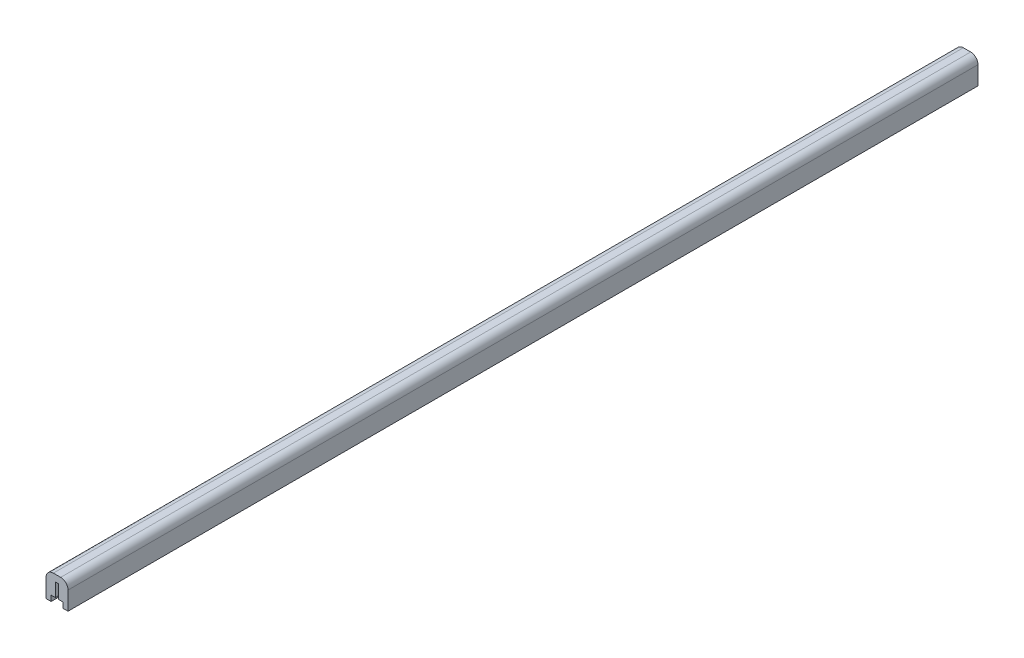
ISO-10303-21;
HEADER;
FILE_DESCRIPTION(('STEP AP214'),'2;1');
FILE_NAME('part.step','',(''),(''),'','','');
FILE_SCHEMA(('AUTOMOTIVE_DESIGN { 1 0 10303 214 1 1 1 1 }'));
ENDSEC;
DATA;
#1=APPLICATION_CONTEXT('core data for automotive mechanical design processes');
#2=APPLICATION_PROTOCOL_DEFINITION('international standard','automotive_design',2000,#1);
#3=PRODUCT_CONTEXT('',#1,'mechanical');
#4=PRODUCT('Part','Part','',(#3));
#5=PRODUCT_RELATED_PRODUCT_CATEGORY('part','',(#4));
#6=PRODUCT_DEFINITION_FORMATION('','',#4);
#7=PRODUCT_DEFINITION_CONTEXT('part definition',#1,'design');
#8=PRODUCT_DEFINITION('design','',#6,#7);
#9=PRODUCT_DEFINITION_SHAPE('','',#8);
#10=(LENGTH_UNIT() NAMED_UNIT(*) SI_UNIT(.MILLI.,.METRE.));
#11=(NAMED_UNIT(*) PLANE_ANGLE_UNIT() SI_UNIT($,.RADIAN.));
#12=(NAMED_UNIT(*) SI_UNIT($,.STERADIAN.) SOLID_ANGLE_UNIT());
#13=UNCERTAINTY_MEASURE_WITH_UNIT(LENGTH_MEASURE(1.E-05),#10,'distance_accuracy_value','');
#14=(GEOMETRIC_REPRESENTATION_CONTEXT(3) GLOBAL_UNCERTAINTY_ASSIGNED_CONTEXT((#13)) GLOBAL_UNIT_ASSIGNED_CONTEXT((#10,
#11,#12)) REPRESENTATION_CONTEXT('',''));
#15=CARTESIAN_POINT('',(0.,0.,0.));
#16=DIRECTION('',(0.,0.,1.));
#17=DIRECTION('',(1.,0.,0.));
#18=AXIS2_PLACEMENT_3D('',#15,#16,#17);
#19=CARTESIAN_POINT('',(8.,0.,1240.));
#20=DIRECTION('',(0.,1.,0.));
#21=DIRECTION('',(-1.,0.,0.));
#22=AXIS2_PLACEMENT_3D('',#19,#20,#21);
#23=PLANE('',#22);
#24=DIRECTION('',(1.,0.,0.));
#25=VECTOR('',#24,1.);
#26=CARTESIAN_POINT('',(8.,0.,0.));
#27=LINE('',#26,#25);
#28=CARTESIAN_POINT('',(8.,0.,0.));
#29=VERTEX_POINT('',#28);
#30=CARTESIAN_POINT('',(15.,0.,0.));
#31=VERTEX_POINT('',#30);
#32=EDGE_CURVE('E169',#29,#31,#27,.T.);
#33=ORIENTED_EDGE('',*,*,#32,.T.);
#34=DIRECTION('',(0.,0.,-1.));
#35=VECTOR('',#34,1.);
#36=CARTESIAN_POINT('',(15.,0.,1240.));
#37=LINE('',#36,#35);
#38=CARTESIAN_POINT('',(15.,0.,1240.));
#39=VERTEX_POINT('',#38);
#40=EDGE_CURVE('E11',#39,#31,#37,.T.);
#41=ORIENTED_EDGE('',*,*,#40,.F.);
#42=DIRECTION('',(1.,0.,0.));
#43=VECTOR('',#42,1.);
#44=CARTESIAN_POINT('',(8.,0.,1240.));
#45=LINE('',#44,#43);
#46=CARTESIAN_POINT('',(8.,0.,1240.));
#47=VERTEX_POINT('',#46);
#48=EDGE_CURVE('E195',#47,#39,#45,.T.);
#49=ORIENTED_EDGE('',*,*,#48,.F.);
#50=DIRECTION('',(0.,0.,-1.));
#51=VECTOR('',#50,1.);
#52=CARTESIAN_POINT('',(8.,0.,1240.));
#53=LINE('',#52,#51);
#54=EDGE_CURVE('E165',#47,#29,#53,.T.);
#55=ORIENTED_EDGE('',*,*,#54,.T.);
#56=EDGE_LOOP('',(#33,#41,#49,#55));
#57=FACE_BOUND('',#56,.T.);
#58=ADVANCED_FACE('F37',(#57),#23,.F.);
#59=CARTESIAN_POINT('',(15.,25.,1240.));
#60=DIRECTION('',(-1.,0.,0.));
#61=DIRECTION('',(0.,-1.,0.));
#62=AXIS2_PLACEMENT_3D('',#59,#60,#61);
#63=PLANE('',#62);
#64=DIRECTION('',(0.,1.,0.));
#65=VECTOR('',#64,1.);
#66=CARTESIAN_POINT('',(15.,25.,0.));
#67=LINE('',#66,#65);
#68=CARTESIAN_POINT('',(15.,25.,0.));
#69=VERTEX_POINT('',#68);
#70=EDGE_CURVE('E172',#31,#69,#67,.T.);
#71=ORIENTED_EDGE('',*,*,#70,.T.);
#72=DIRECTION('',(0.,0.,-1.));
#73=VECTOR('',#72,1.);
#74=CARTESIAN_POINT('',(15.,25.,1240.));
#75=LINE('',#74,#73);
#76=CARTESIAN_POINT('',(15.,25.,1240.));
#77=VERTEX_POINT('',#76);
#78=EDGE_CURVE('E45',#77,#69,#75,.T.);
#79=ORIENTED_EDGE('',*,*,#78,.F.);
#80=DIRECTION('',(0.,1.,0.));
#81=VECTOR('',#80,1.);
#82=CARTESIAN_POINT('',(15.,25.,1240.));
#83=LINE('',#82,#81);
#84=EDGE_CURVE('E114',#39,#77,#83,.T.);
#85=ORIENTED_EDGE('',*,*,#84,.F.);
#86=ORIENTED_EDGE('',*,*,#40,.T.);
#87=EDGE_LOOP('',(#71,#79,#85,#86));
#88=FACE_BOUND('',#87,.T.);
#89=ADVANCED_FACE('F283',(#88),#63,.F.);
#90=CARTESIAN_POINT('',(5.,25.,1240.));
#91=DIRECTION('',(0.,0.,-1.));
#92=DIRECTION('',(-1.,0.,0.));
#93=AXIS2_PLACEMENT_3D('',#90,#91,#92);
#94=CYLINDRICAL_SURFACE('',#93,10.);
#95=CARTESIAN_POINT('',(5.,25.,0.));
#96=DIRECTION('',(0.,0.,1.));
#97=DIRECTION('',(-1.,0.,0.));
#98=AXIS2_PLACEMENT_3D('',#95,#96,#97);
#99=CIRCLE('',#98,10.);
#100=CARTESIAN_POINT('',(4.99999999999999,35.,0.));
#101=VERTEX_POINT('',#100);
#102=EDGE_CURVE('E174',#69,#101,#99,.T.);
#103=ORIENTED_EDGE('',*,*,#102,.T.);
#104=DIRECTION('',(0.,0.,-1.));
#105=VECTOR('',#104,1.);
#106=CARTESIAN_POINT('',(4.99999999999999,35.,1240.));
#107=LINE('',#106,#105);
#108=CARTESIAN_POINT('',(4.99999999999999,35.,1240.));
#109=VERTEX_POINT('',#108);
#110=EDGE_CURVE('E220',#109,#101,#107,.T.);
#111=ORIENTED_EDGE('',*,*,#110,.F.);
#112=CARTESIAN_POINT('',(5.,25.,1240.));
#113=DIRECTION('',(0.,0.,1.));
#114=DIRECTION('',(-1.,0.,0.));
#115=AXIS2_PLACEMENT_3D('',#112,#113,#114);
#116=CIRCLE('',#115,10.);
#117=EDGE_CURVE('E228',#77,#109,#116,.T.);
#118=ORIENTED_EDGE('',*,*,#117,.F.);
#119=ORIENTED_EDGE('',*,*,#78,.T.);
#120=EDGE_LOOP('',(#103,#111,#118,#119));
#121=FACE_BOUND('',#120,.T.);
#122=ADVANCED_FACE('F226',(#121),#94,.T.);
#123=CARTESIAN_POINT('',(-5.,35.,1240.));
#124=DIRECTION('',(0.,-1.,0.));
#125=DIRECTION('',(0.,0.,-1.));
#126=AXIS2_PLACEMENT_3D('',#123,#124,#125);
#127=PLANE('',#126);
#128=DIRECTION('',(-1.,0.,0.));
#129=VECTOR('',#128,1.);
#130=CARTESIAN_POINT('',(-5.,35.,0.));
#131=LINE('',#130,#129);
#132=CARTESIAN_POINT('',(-5.,35.,0.));
#133=VERTEX_POINT('',#132);
#134=EDGE_CURVE('E176',#101,#133,#131,.T.);
#135=ORIENTED_EDGE('',*,*,#134,.T.);
#136=DIRECTION('',(0.,0.,-1.));
#137=VECTOR('',#136,1.);
#138=CARTESIAN_POINT('',(-5.,35.,1240.));
#139=LINE('',#138,#137);
#140=CARTESIAN_POINT('',(-5.,35.,1240.));
#141=VERTEX_POINT('',#140);
#142=EDGE_CURVE('E217',#141,#133,#139,.T.);
#143=ORIENTED_EDGE('',*,*,#142,.F.);
#144=DIRECTION('',(-1.,0.,0.));
#145=VECTOR('',#144,1.);
#146=CARTESIAN_POINT('',(-5.,35.,1240.));
#147=LINE('',#146,#145);
#148=EDGE_CURVE('E246',#109,#141,#147,.T.);
#149=ORIENTED_EDGE('',*,*,#148,.F.);
#150=ORIENTED_EDGE('',*,*,#110,.T.);
#151=EDGE_LOOP('',(#135,#143,#149,#150));
#152=FACE_BOUND('',#151,.T.);
#153=ADVANCED_FACE('F237',(#152),#127,.F.);
#154=CARTESIAN_POINT('',(-5.00000000000001,25.,1240.));
#155=DIRECTION('',(0.,0.,-1.));
#156=DIRECTION('',(-1.,0.,0.));
#157=AXIS2_PLACEMENT_3D('',#154,#155,#156);
#158=CYLINDRICAL_SURFACE('',#157,10.);
#159=CARTESIAN_POINT('',(-5.00000000000001,25.,0.));
#160=DIRECTION('',(0.,0.,1.));
#161=DIRECTION('',(-1.,0.,0.));
#162=AXIS2_PLACEMENT_3D('',#159,#160,#161);
#163=CIRCLE('',#162,10.);
#164=CARTESIAN_POINT('',(-15.,25.,0.));
#165=VERTEX_POINT('',#164);
#166=EDGE_CURVE('E178',#133,#165,#163,.T.);
#167=ORIENTED_EDGE('',*,*,#166,.T.);
#168=DIRECTION('',(0.,0.,-1.));
#169=VECTOR('',#168,1.);
#170=CARTESIAN_POINT('',(-15.,25.,1240.));
#171=LINE('',#170,#169);
#172=CARTESIAN_POINT('',(-15.,25.,1240.));
#173=VERTEX_POINT('',#172);
#174=EDGE_CURVE('E214',#173,#165,#171,.T.);
#175=ORIENTED_EDGE('',*,*,#174,.F.);
#176=CARTESIAN_POINT('',(-5.00000000000001,25.,1240.));
#177=DIRECTION('',(0.,0.,1.));
#178=DIRECTION('',(-1.,0.,0.));
#179=AXIS2_PLACEMENT_3D('',#176,#177,#178);
#180=CIRCLE('',#179,10.);
#181=EDGE_CURVE('E243',#141,#173,#180,.T.);
#182=ORIENTED_EDGE('',*,*,#181,.F.);
#183=ORIENTED_EDGE('',*,*,#142,.T.);
#184=EDGE_LOOP('',(#167,#175,#182,#183));
#185=FACE_BOUND('',#184,.T.);
#186=ADVANCED_FACE('F241',(#185),#158,.T.);
#187=CARTESIAN_POINT('',(-15.,0.,1240.));
#188=DIRECTION('',(1.,0.,0.));
#189=DIRECTION('',(0.,1.,0.));
#190=AXIS2_PLACEMENT_3D('',#187,#188,#189);
#191=PLANE('',#190);
#192=DIRECTION('',(0.,-1.,0.));
#193=VECTOR('',#192,1.);
#194=CARTESIAN_POINT('',(-15.,0.,0.));
#195=LINE('',#194,#193);
#196=CARTESIAN_POINT('',(-15.,0.,0.));
#197=VERTEX_POINT('',#196);
#198=EDGE_CURVE('E180',#165,#197,#195,.T.);
#199=ORIENTED_EDGE('',*,*,#198,.T.);
#200=DIRECTION('',(0.,0.,-1.));
#201=VECTOR('',#200,1.);
#202=CARTESIAN_POINT('',(-15.,0.,1240.));
#203=LINE('',#202,#201);
#204=CARTESIAN_POINT('',(-15.,0.,1240.));
#205=VERTEX_POINT('',#204);
#206=EDGE_CURVE('E211',#205,#197,#203,.T.);
#207=ORIENTED_EDGE('',*,*,#206,.F.);
#208=DIRECTION('',(0.,-1.,0.));
#209=VECTOR('',#208,1.);
#210=CARTESIAN_POINT('',(-15.,0.,1240.));
#211=LINE('',#210,#209);
#212=EDGE_CURVE('E245',#173,#205,#211,.T.);
#213=ORIENTED_EDGE('',*,*,#212,.F.);
#214=ORIENTED_EDGE('',*,*,#174,.T.);
#215=EDGE_LOOP('',(#199,#207,#213,#214));
#216=FACE_BOUND('',#215,.T.);
#217=ADVANCED_FACE('F296',(#216),#191,.F.);
#218=CARTESIAN_POINT('',(-15.,0.,1240.));
#219=DIRECTION('',(0.,1.,0.));
#220=DIRECTION('',(0.,0.,1.));
#221=AXIS2_PLACEMENT_3D('',#218,#219,#220);
#222=PLANE('',#221);
#223=DIRECTION('',(1.,0.,0.));
#224=VECTOR('',#223,1.);
#225=CARTESIAN_POINT('',(-15.,0.,0.));
#226=LINE('',#225,#224);
#227=CARTESIAN_POINT('',(-8.,0.,0.));
#228=VERTEX_POINT('',#227);
#229=EDGE_CURVE('E182',#197,#228,#226,.T.);
#230=ORIENTED_EDGE('',*,*,#229,.T.);
#231=DIRECTION('',(0.,0.,-1.));
#232=VECTOR('',#231,1.);
#233=CARTESIAN_POINT('',(-8.,0.,1240.));
#234=LINE('',#233,#232);
#235=CARTESIAN_POINT('',(-8.,0.,1240.));
#236=VERTEX_POINT('',#235);
#237=EDGE_CURVE('E208',#236,#228,#234,.T.);
#238=ORIENTED_EDGE('',*,*,#237,.F.);
#239=DIRECTION('',(1.,0.,0.));
#240=VECTOR('',#239,1.);
#241=CARTESIAN_POINT('',(-15.,0.,1240.));
#242=LINE('',#241,#240);
#243=EDGE_CURVE('E248',#205,#236,#242,.T.);
#244=ORIENTED_EDGE('',*,*,#243,.F.);
#245=ORIENTED_EDGE('',*,*,#206,.T.);
#246=EDGE_LOOP('',(#230,#238,#244,#245));
#247=FACE_BOUND('',#246,.T.);
#248=ADVANCED_FACE('F299',(#247),#222,.F.);
#249=CARTESIAN_POINT('',(-8.,0.,1240.));
#250=DIRECTION('',(-1.,0.,0.));
#251=DIRECTION('',(0.,0.,1.));
#252=AXIS2_PLACEMENT_3D('',#249,#250,#251);
#253=PLANE('',#252);
#254=DIRECTION('',(0.,1.,0.));
#255=VECTOR('',#254,1.);
#256=CARTESIAN_POINT('',(-8.,0.,0.));
#257=LINE('',#256,#255);
#258=CARTESIAN_POINT('',(-8.,7.5,0.));
#259=VERTEX_POINT('',#258);
#260=EDGE_CURVE('E184',#228,#259,#257,.T.);
#261=ORIENTED_EDGE('',*,*,#260,.T.);
#262=DIRECTION('',(0.,0.,-1.));
#263=VECTOR('',#262,1.);
#264=CARTESIAN_POINT('',(-8.,7.5,1240.));
#265=LINE('',#264,#263);
#266=CARTESIAN_POINT('',(-8.,7.5,1240.));
#267=VERTEX_POINT('',#266);
#268=EDGE_CURVE('E205',#267,#259,#265,.T.);
#269=ORIENTED_EDGE('',*,*,#268,.F.);
#270=DIRECTION('',(0.,1.,0.));
#271=VECTOR('',#270,1.);
#272=CARTESIAN_POINT('',(-8.,0.,1240.));
#273=LINE('',#272,#271);
#274=EDGE_CURVE('E254',#236,#267,#273,.T.);
#275=ORIENTED_EDGE('',*,*,#274,.F.);
#276=ORIENTED_EDGE('',*,*,#237,.T.);
#277=EDGE_LOOP('',(#261,#269,#275,#276));
#278=FACE_BOUND('',#277,.T.);
#279=ADVANCED_FACE('F303',(#278),#253,.F.);
#280=CARTESIAN_POINT('',(-8.,7.5,1240.));
#281=DIRECTION('',(0.,1.,0.));
#282=DIRECTION('',(0.,0.,1.));
#283=AXIS2_PLACEMENT_3D('',#280,#281,#282);
#284=PLANE('',#283);
#285=DIRECTION('',(1.,0.,0.));
#286=VECTOR('',#285,1.);
#287=CARTESIAN_POINT('',(-8.,7.5,0.));
#288=LINE('',#287,#286);
#289=CARTESIAN_POINT('',(-2.25,7.5,0.));
#290=VERTEX_POINT('',#289);
#291=EDGE_CURVE('E186',#259,#290,#288,.T.);
#292=ORIENTED_EDGE('',*,*,#291,.T.);
#293=DIRECTION('',(0.,0.,-1.));
#294=VECTOR('',#293,1.);
#295=CARTESIAN_POINT('',(-2.25,7.5,1240.));
#296=LINE('',#295,#294);
#297=CARTESIAN_POINT('',(-2.25,7.5,1240.));
#298=VERTEX_POINT('',#297);
#299=EDGE_CURVE('E202',#298,#290,#296,.T.);
#300=ORIENTED_EDGE('',*,*,#299,.F.);
#301=DIRECTION('',(1.,0.,0.));
#302=VECTOR('',#301,1.);
#303=CARTESIAN_POINT('',(-8.,7.5,1240.));
#304=LINE('',#303,#302);
#305=EDGE_CURVE('E256',#267,#298,#304,.T.);
#306=ORIENTED_EDGE('',*,*,#305,.F.);
#307=ORIENTED_EDGE('',*,*,#268,.T.);
#308=EDGE_LOOP('',(#292,#300,#306,#307));
#309=FACE_BOUND('',#308,.T.);
#310=ADVANCED_FACE('F307',(#309),#284,.F.);
#311=CARTESIAN_POINT('',(-2.25,7.5,1240.));
#312=DIRECTION('',(-1.,0.,0.));
#313=DIRECTION('',(0.,0.,1.));
#314=AXIS2_PLACEMENT_3D('',#311,#312,#313);
#315=PLANE('',#314);
#316=DIRECTION('',(0.,1.,0.));
#317=VECTOR('',#316,1.);
#318=CARTESIAN_POINT('',(-2.25,7.5,0.));
#319=LINE('',#318,#317);
#320=CARTESIAN_POINT('',(-2.25,26.,0.));
#321=VERTEX_POINT('',#320);
#322=EDGE_CURVE('E188',#290,#321,#319,.T.);
#323=ORIENTED_EDGE('',*,*,#322,.T.);
#324=DIRECTION('',(0.,0.,-1.));
#325=VECTOR('',#324,1.);
#326=CARTESIAN_POINT('',(-2.25,26.,1240.));
#327=LINE('',#326,#325);
#328=CARTESIAN_POINT('',(-2.25,26.,1240.));
#329=VERTEX_POINT('',#328);
#330=EDGE_CURVE('E199',#329,#321,#327,.T.);
#331=ORIENTED_EDGE('',*,*,#330,.F.);
#332=DIRECTION('',(0.,1.,0.));
#333=VECTOR('',#332,1.);
#334=CARTESIAN_POINT('',(-2.25,7.5,1240.));
#335=LINE('',#334,#333);
#336=EDGE_CURVE('E258',#298,#329,#335,.T.);
#337=ORIENTED_EDGE('',*,*,#336,.F.);
#338=ORIENTED_EDGE('',*,*,#299,.T.);
#339=EDGE_LOOP('',(#323,#331,#337,#338));
#340=FACE_BOUND('',#339,.T.);
#341=ADVANCED_FACE('F264',(#340),#315,.F.);
#342=CARTESIAN_POINT('',(-2.25,26.,1240.));
#343=DIRECTION('',(0.,1.,0.));
#344=DIRECTION('',(0.,0.,1.));
#345=AXIS2_PLACEMENT_3D('',#342,#343,#344);
#346=PLANE('',#345);
#347=DIRECTION('',(1.,0.,0.));
#348=VECTOR('',#347,1.);
#349=CARTESIAN_POINT('',(-2.25,26.,0.));
#350=LINE('',#349,#348);
#351=CARTESIAN_POINT('',(2.25,26.,0.));
#352=VERTEX_POINT('',#351);
#353=EDGE_CURVE('E190',#321,#352,#350,.T.);
#354=ORIENTED_EDGE('',*,*,#353,.T.);
#355=DIRECTION('',(0.,0.,-1.));
#356=VECTOR('',#355,1.);
#357=CARTESIAN_POINT('',(2.25,26.,1240.));
#358=LINE('',#357,#356);
#359=CARTESIAN_POINT('',(2.25,26.,1240.));
#360=VERTEX_POINT('',#359);
#361=EDGE_CURVE('E160',#360,#352,#358,.T.);
#362=ORIENTED_EDGE('',*,*,#361,.F.);
#363=DIRECTION('',(1.,0.,0.));
#364=VECTOR('',#363,1.);
#365=CARTESIAN_POINT('',(-2.25,26.,1240.));
#366=LINE('',#365,#364);
#367=EDGE_CURVE('E151',#329,#360,#366,.T.);
#368=ORIENTED_EDGE('',*,*,#367,.F.);
#369=ORIENTED_EDGE('',*,*,#330,.T.);
#370=EDGE_LOOP('',(#354,#362,#368,#369));
#371=FACE_BOUND('',#370,.T.);
#372=ADVANCED_FACE('F268',(#371),#346,.F.);
#373=CARTESIAN_POINT('',(2.25,26.,1240.));
#374=DIRECTION('',(1.,0.,0.));
#375=DIRECTION('',(0.,0.,-1.));
#376=AXIS2_PLACEMENT_3D('',#373,#374,#375);
#377=PLANE('',#376);
#378=DIRECTION('',(0.,-1.,0.));
#379=VECTOR('',#378,1.);
#380=CARTESIAN_POINT('',(2.25,26.,0.));
#381=LINE('',#380,#379);
#382=CARTESIAN_POINT('',(2.25,7.5,0.));
#383=VERTEX_POINT('',#382);
#384=EDGE_CURVE('E159',#352,#383,#381,.T.);
#385=ORIENTED_EDGE('',*,*,#384,.T.);
#386=DIRECTION('',(0.,0.,-1.));
#387=VECTOR('',#386,1.);
#388=CARTESIAN_POINT('',(2.25,7.5,1240.));
#389=LINE('',#388,#387);
#390=CARTESIAN_POINT('',(2.25,7.5,1240.));
#391=VERTEX_POINT('',#390);
#392=EDGE_CURVE('E156',#391,#383,#389,.T.);
#393=ORIENTED_EDGE('',*,*,#392,.F.);
#394=DIRECTION('',(0.,-1.,0.));
#395=VECTOR('',#394,1.);
#396=CARTESIAN_POINT('',(2.25,26.,1240.));
#397=LINE('',#396,#395);
#398=EDGE_CURVE('E145',#360,#391,#397,.T.);
#399=ORIENTED_EDGE('',*,*,#398,.F.);
#400=ORIENTED_EDGE('',*,*,#361,.T.);
#401=EDGE_LOOP('',(#385,#393,#399,#400));
#402=FACE_BOUND('',#401,.T.);
#403=ADVANCED_FACE('F157',(#402),#377,.F.);
#404=CARTESIAN_POINT('',(2.25,7.5,1240.));
#405=DIRECTION('',(0.,1.,0.));
#406=DIRECTION('',(0.,0.,1.));
#407=AXIS2_PLACEMENT_3D('',#404,#405,#406);
#408=PLANE('',#407);
#409=DIRECTION('',(1.,0.,0.));
#410=VECTOR('',#409,1.);
#411=CARTESIAN_POINT('',(2.25,7.5,0.));
#412=LINE('',#411,#410);
#413=CARTESIAN_POINT('',(8.,7.5,0.));
#414=VERTEX_POINT('',#413);
#415=EDGE_CURVE('E100',#383,#414,#412,.T.);
#416=ORIENTED_EDGE('',*,*,#415,.T.);
#417=DIRECTION('',(0.,0.,-1.));
#418=VECTOR('',#417,1.);
#419=CARTESIAN_POINT('',(8.,7.5,1240.));
#420=LINE('',#419,#418);
#421=CARTESIAN_POINT('',(8.,7.5,1240.));
#422=VERTEX_POINT('',#421);
#423=EDGE_CURVE('E161',#422,#414,#420,.T.);
#424=ORIENTED_EDGE('',*,*,#423,.F.);
#425=DIRECTION('',(1.,0.,0.));
#426=VECTOR('',#425,1.);
#427=CARTESIAN_POINT('',(2.25,7.5,1240.));
#428=LINE('',#427,#426);
#429=EDGE_CURVE('E149',#391,#422,#428,.T.);
#430=ORIENTED_EDGE('',*,*,#429,.F.);
#431=ORIENTED_EDGE('',*,*,#392,.T.);
#432=EDGE_LOOP('',(#416,#424,#430,#431));
#433=FACE_BOUND('',#432,.T.);
#434=ADVANCED_FACE('F163',(#433),#408,.F.);
#435=CARTESIAN_POINT('',(8.,7.5,1240.));
#436=DIRECTION('',(1.,0.,0.));
#437=DIRECTION('',(0.,0.,-1.));
#438=AXIS2_PLACEMENT_3D('',#435,#436,#437);
#439=PLANE('',#438);
#440=DIRECTION('',(0.,-1.,0.));
#441=VECTOR('',#440,1.);
#442=CARTESIAN_POINT('',(8.,7.5,0.));
#443=LINE('',#442,#441);
#444=EDGE_CURVE('E106',#414,#29,#443,.T.);
#445=ORIENTED_EDGE('',*,*,#444,.T.);
#446=ORIENTED_EDGE('',*,*,#54,.F.);
#447=DIRECTION('',(0.,-1.,0.));
#448=VECTOR('',#447,1.);
#449=CARTESIAN_POINT('',(8.,7.5,1240.));
#450=LINE('',#449,#448);
#451=EDGE_CURVE('E53',#422,#47,#450,.T.);
#452=ORIENTED_EDGE('',*,*,#451,.F.);
#453=ORIENTED_EDGE('',*,*,#423,.T.);
#454=EDGE_LOOP('',(#445,#446,#452,#453));
#455=FACE_BOUND('',#454,.T.);
#456=ADVANCED_FACE('F272',(#455),#439,.F.);
#457=CARTESIAN_POINT('',(5.,25.,1240.));
#458=DIRECTION('',(0.,0.,-1.));
#459=DIRECTION('',(-1.,0.,0.));
#460=AXIS2_PLACEMENT_3D('',#457,#458,#459);
#461=PLANE('',#460);
#462=ORIENTED_EDGE('',*,*,#48,.T.);
#463=ORIENTED_EDGE('',*,*,#84,.T.);
#464=ORIENTED_EDGE('',*,*,#117,.T.);
#465=ORIENTED_EDGE('',*,*,#148,.T.);
#466=ORIENTED_EDGE('',*,*,#181,.T.);
#467=ORIENTED_EDGE('',*,*,#212,.T.);
#468=ORIENTED_EDGE('',*,*,#243,.T.);
#469=ORIENTED_EDGE('',*,*,#274,.T.);
#470=ORIENTED_EDGE('',*,*,#305,.T.);
#471=ORIENTED_EDGE('',*,*,#336,.T.);
#472=ORIENTED_EDGE('',*,*,#367,.T.);
#473=ORIENTED_EDGE('',*,*,#398,.T.);
#474=ORIENTED_EDGE('',*,*,#429,.T.);
#475=ORIENTED_EDGE('',*,*,#451,.T.);
#476=EDGE_LOOP('',(#462,#463,#464,#465,#466,#467,#468,#469,#470,#471,#472,#473,#474,#475));
#477=FACE_BOUND('',#476,.T.);
#478=ADVANCED_FACE('F147',(#477),#461,.F.);
#479=CARTESIAN_POINT('',(5.,25.,0.));
#480=DIRECTION('',(0.,0.,-1.));
#481=DIRECTION('',(-1.,0.,0.));
#482=AXIS2_PLACEMENT_3D('',#479,#480,#481);
#483=PLANE('',#482);
#484=ORIENTED_EDGE('',*,*,#32,.F.);
#485=ORIENTED_EDGE('',*,*,#444,.F.);
#486=ORIENTED_EDGE('',*,*,#415,.F.);
#487=ORIENTED_EDGE('',*,*,#384,.F.);
#488=ORIENTED_EDGE('',*,*,#353,.F.);
#489=ORIENTED_EDGE('',*,*,#322,.F.);
#490=ORIENTED_EDGE('',*,*,#291,.F.);
#491=ORIENTED_EDGE('',*,*,#260,.F.);
#492=ORIENTED_EDGE('',*,*,#229,.F.);
#493=ORIENTED_EDGE('',*,*,#198,.F.);
#494=ORIENTED_EDGE('',*,*,#166,.F.);
#495=ORIENTED_EDGE('',*,*,#134,.F.);
#496=ORIENTED_EDGE('',*,*,#102,.F.);
#497=ORIENTED_EDGE('',*,*,#70,.F.);
#498=EDGE_LOOP('',(#484,#485,#486,#487,#488,#489,#490,#491,#492,#493,#494,#495,#496,#497));
#499=FACE_BOUND('',#498,.T.);
#500=ADVANCED_FACE('F232',(#499),#483,.T.);
#501=CLOSED_SHELL('',(#58,#89,#122,#153,#186,#217,#248,#279,#310,#341,#372,#403,#434,#456,#478,#500));
#502=MANIFOLD_SOLID_BREP('B2',#501);
#503=ADVANCED_BREP_SHAPE_REPRESENTATION('',(#18,#502),#14);
#504=SHAPE_DEFINITION_REPRESENTATION(#9,#503);
ENDSEC;
END-ISO-10303-21;
